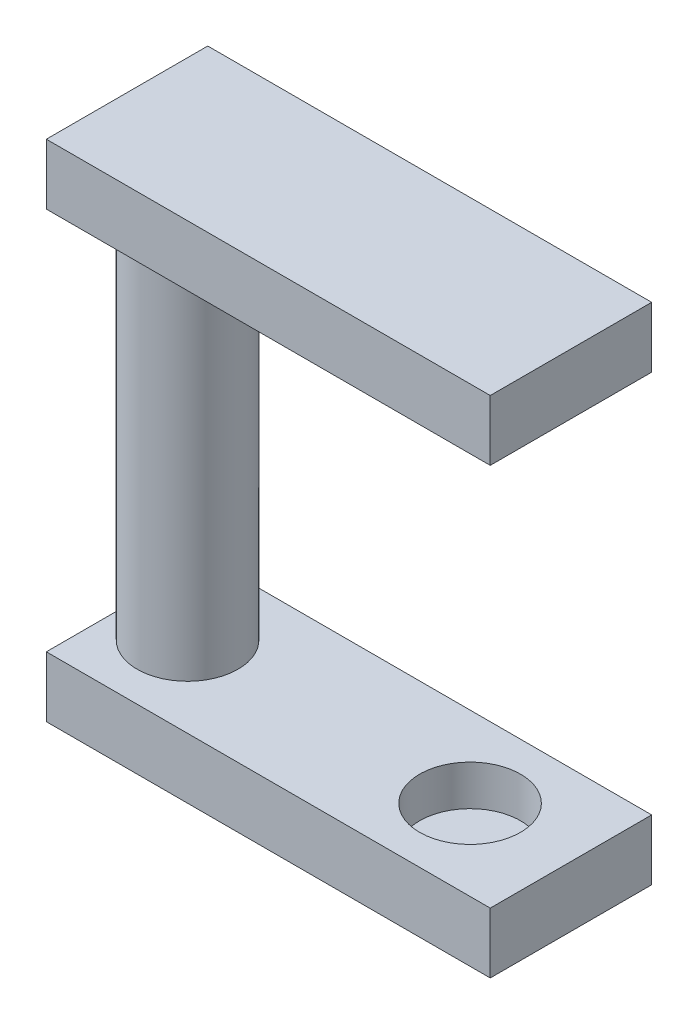
ISO-10303-21;
HEADER;
FILE_DESCRIPTION(('STEP AP214'),'2;1');
FILE_NAME('part.step','',(''),(''),'','','');
FILE_SCHEMA(('AUTOMOTIVE_DESIGN { 1 0 10303 214 1 1 1 1 }'));
ENDSEC;
DATA;
#1=APPLICATION_CONTEXT('core data for automotive mechanical design processes');
#2=APPLICATION_PROTOCOL_DEFINITION('international standard','automotive_design',2000,#1);
#3=PRODUCT_CONTEXT('',#1,'mechanical');
#4=PRODUCT('Part','Part','',(#3));
#5=PRODUCT_RELATED_PRODUCT_CATEGORY('part','',(#4));
#6=PRODUCT_DEFINITION_FORMATION('','',#4);
#7=PRODUCT_DEFINITION_CONTEXT('part definition',#1,'design');
#8=PRODUCT_DEFINITION('design','',#6,#7);
#9=PRODUCT_DEFINITION_SHAPE('','',#8);
#10=(LENGTH_UNIT() NAMED_UNIT(*) SI_UNIT(.MILLI.,.METRE.));
#11=(NAMED_UNIT(*) PLANE_ANGLE_UNIT() SI_UNIT($,.RADIAN.));
#12=(NAMED_UNIT(*) SI_UNIT($,.STERADIAN.) SOLID_ANGLE_UNIT());
#13=UNCERTAINTY_MEASURE_WITH_UNIT(LENGTH_MEASURE(1.E-05),#10,'distance_accuracy_value','');
#14=(GEOMETRIC_REPRESENTATION_CONTEXT(3) GLOBAL_UNCERTAINTY_ASSIGNED_CONTEXT((#13)) GLOBAL_UNIT_ASSIGNED_CONTEXT((#10,
#11,#12)) REPRESENTATION_CONTEXT('',''));
#15=CARTESIAN_POINT('',(0.,0.,0.));
#16=DIRECTION('',(0.,0.,1.));
#17=DIRECTION('',(1.,0.,0.));
#18=AXIS2_PLACEMENT_3D('',#15,#16,#17);
#19=CARTESIAN_POINT('',(-7.62,55.88,-10.16));
#20=DIRECTION('',(1.,0.,0.));
#21=DIRECTION('',(0.,0.,-1.));
#22=AXIS2_PLACEMENT_3D('',#19,#20,#21);
#23=PLANE('',#22);
#24=DIRECTION('',(0.,0.,1.));
#25=VECTOR('',#24,1.);
#26=CARTESIAN_POINT('',(-7.62,48.26,-10.16));
#27=LINE('',#26,#25);
#28=CARTESIAN_POINT('',(-7.62,48.26,-10.16));
#29=VERTEX_POINT('',#28);
#30=CARTESIAN_POINT('',(-7.62,48.26,10.16));
#31=VERTEX_POINT('',#30);
#32=EDGE_CURVE('E112',#29,#31,#27,.T.);
#33=ORIENTED_EDGE('',*,*,#32,.T.);
#34=DIRECTION('',(0.,-1.,0.));
#35=VECTOR('',#34,1.);
#36=CARTESIAN_POINT('',(-7.62,55.88,10.16));
#37=LINE('',#36,#35);
#38=CARTESIAN_POINT('',(-7.62,55.88,10.16));
#39=VERTEX_POINT('',#38);
#40=EDGE_CURVE('E12',#39,#31,#37,.T.);
#41=ORIENTED_EDGE('',*,*,#40,.F.);
#42=DIRECTION('',(0.,0.,1.));
#43=VECTOR('',#42,1.);
#44=CARTESIAN_POINT('',(-7.62,55.88,-10.16));
#45=LINE('',#44,#43);
#46=CARTESIAN_POINT('',(-7.62,55.88,-10.16));
#47=VERTEX_POINT('',#46);
#48=EDGE_CURVE('E100',#47,#39,#45,.T.);
#49=ORIENTED_EDGE('',*,*,#48,.F.);
#50=DIRECTION('',(0.,-1.,0.));
#51=VECTOR('',#50,1.);
#52=CARTESIAN_POINT('',(-7.62,55.88,-10.16));
#53=LINE('',#52,#51);
#54=EDGE_CURVE('E108',#47,#29,#53,.T.);
#55=ORIENTED_EDGE('',*,*,#54,.T.);
#56=EDGE_LOOP('',(#33,#41,#49,#55));
#57=FACE_BOUND('',#56,.T.);
#58=ADVANCED_FACE('F49',(#57),#23,.F.);
#59=CARTESIAN_POINT('',(-7.62,55.88,10.16));
#60=DIRECTION('',(0.,0.,-1.));
#61=DIRECTION('',(-1.,0.,0.));
#62=AXIS2_PLACEMENT_3D('',#59,#60,#61);
#63=PLANE('',#62);
#64=DIRECTION('',(1.,0.,0.));
#65=VECTOR('',#64,1.);
#66=CARTESIAN_POINT('',(-7.62,48.26,10.16));
#67=LINE('',#66,#65);
#68=CARTESIAN_POINT('',(48.26,48.26,10.16));
#69=VERTEX_POINT('',#68);
#70=EDGE_CURVE('E104',#31,#69,#67,.T.);
#71=ORIENTED_EDGE('',*,*,#70,.T.);
#72=DIRECTION('',(0.,-1.,0.));
#73=VECTOR('',#72,1.);
#74=CARTESIAN_POINT('',(48.26,55.88,10.16));
#75=LINE('',#74,#73);
#76=CARTESIAN_POINT('',(48.26,55.88,10.16));
#77=VERTEX_POINT('',#76);
#78=EDGE_CURVE('E57',#77,#69,#75,.T.);
#79=ORIENTED_EDGE('',*,*,#78,.F.);
#80=DIRECTION('',(1.,0.,0.));
#81=VECTOR('',#80,1.);
#82=CARTESIAN_POINT('',(-7.62,55.88,10.16));
#83=LINE('',#82,#81);
#84=EDGE_CURVE('E95',#39,#77,#83,.T.);
#85=ORIENTED_EDGE('',*,*,#84,.F.);
#86=ORIENTED_EDGE('',*,*,#40,.T.);
#87=EDGE_LOOP('',(#71,#79,#85,#86));
#88=FACE_BOUND('',#87,.T.);
#89=ADVANCED_FACE('F103',(#88),#63,.F.);
#90=CARTESIAN_POINT('',(48.26,55.88,-10.16));
#91=DIRECTION('',(-1.,0.,0.));
#92=DIRECTION('',(0.,0.,1.));
#93=AXIS2_PLACEMENT_3D('',#90,#91,#92);
#94=PLANE('',#93);
#95=DIRECTION('',(0.,0.,-1.));
#96=VECTOR('',#95,1.);
#97=CARTESIAN_POINT('',(48.26,48.26,-10.16));
#98=LINE('',#97,#96);
#99=CARTESIAN_POINT('',(48.26,48.26,-10.16));
#100=VERTEX_POINT('',#99);
#101=EDGE_CURVE('E82',#69,#100,#98,.T.);
#102=ORIENTED_EDGE('',*,*,#101,.T.);
#103=DIRECTION('',(0.,-1.,0.));
#104=VECTOR('',#103,1.);
#105=CARTESIAN_POINT('',(48.26,55.88,-10.16));
#106=LINE('',#105,#104);
#107=CARTESIAN_POINT('',(48.26,55.88,-10.16));
#108=VERTEX_POINT('',#107);
#109=EDGE_CURVE('E105',#108,#100,#106,.T.);
#110=ORIENTED_EDGE('',*,*,#109,.F.);
#111=DIRECTION('',(0.,0.,-1.));
#112=VECTOR('',#111,1.);
#113=CARTESIAN_POINT('',(48.26,55.88,-10.16));
#114=LINE('',#113,#112);
#115=EDGE_CURVE('E98',#77,#108,#114,.T.);
#116=ORIENTED_EDGE('',*,*,#115,.F.);
#117=ORIENTED_EDGE('',*,*,#78,.T.);
#118=EDGE_LOOP('',(#102,#110,#116,#117));
#119=FACE_BOUND('',#118,.T.);
#120=ADVANCED_FACE('F106',(#119),#94,.F.);
#121=CARTESIAN_POINT('',(-7.62,55.88,-10.16));
#122=DIRECTION('',(0.,0.,1.));
#123=DIRECTION('',(1.,0.,0.));
#124=AXIS2_PLACEMENT_3D('',#121,#122,#123);
#125=PLANE('',#124);
#126=DIRECTION('',(-1.,0.,0.));
#127=VECTOR('',#126,1.);
#128=CARTESIAN_POINT('',(-7.62,48.26,-10.16));
#129=LINE('',#128,#127);
#130=EDGE_CURVE('E88',#100,#29,#129,.T.);
#131=ORIENTED_EDGE('',*,*,#130,.T.);
#132=ORIENTED_EDGE('',*,*,#54,.F.);
#133=DIRECTION('',(-1.,0.,0.));
#134=VECTOR('',#133,1.);
#135=CARTESIAN_POINT('',(-7.62,55.88,-10.16));
#136=LINE('',#135,#134);
#137=EDGE_CURVE('E65',#108,#47,#136,.T.);
#138=ORIENTED_EDGE('',*,*,#137,.F.);
#139=ORIENTED_EDGE('',*,*,#109,.T.);
#140=EDGE_LOOP('',(#131,#132,#138,#139));
#141=FACE_BOUND('',#140,.T.);
#142=ADVANCED_FACE('F120',(#141),#125,.F.);
#143=CARTESIAN_POINT('',(0.,55.88,0.));
#144=DIRECTION('',(0.,1.,0.));
#145=DIRECTION('',(0.,0.,1.));
#146=AXIS2_PLACEMENT_3D('',#143,#144,#145);
#147=PLANE('',#146);
#148=ORIENTED_EDGE('',*,*,#48,.T.);
#149=ORIENTED_EDGE('',*,*,#84,.T.);
#150=ORIENTED_EDGE('',*,*,#115,.T.);
#151=ORIENTED_EDGE('',*,*,#137,.T.);
#152=EDGE_LOOP('',(#148,#149,#150,#151));
#153=FACE_BOUND('',#152,.T.);
#154=ADVANCED_FACE('F96',(#153),#147,.T.);
#155=CARTESIAN_POINT('',(0.,48.26,0.));
#156=DIRECTION('',(0.,1.,0.));
#157=DIRECTION('',(0.,0.,1.));
#158=AXIS2_PLACEMENT_3D('',#155,#156,#157);
#159=PLANE('',#158);
#160=CARTESIAN_POINT('',(35.56,48.26,0.));
#161=DIRECTION('',(0.,-1.,0.));
#162=DIRECTION('',(0.,0.,-1.));
#163=AXIS2_PLACEMENT_3D('',#160,#161,#162);
#164=CIRCLE('',#163,6.35000000000002);
#165=CARTESIAN_POINT('',(35.56,48.26,-6.35000000000002));
#166=VERTEX_POINT('',#165);
#167=EDGE_CURVE('E126',#166,#166,#164,.T.);
#168=ORIENTED_EDGE('',*,*,#167,.F.);
#169=EDGE_LOOP('',(#168));
#170=FACE_BOUND('',#169,.T.);
#171=ORIENTED_EDGE('',*,*,#32,.F.);
#172=ORIENTED_EDGE('',*,*,#130,.F.);
#173=ORIENTED_EDGE('',*,*,#101,.F.);
#174=ORIENTED_EDGE('',*,*,#70,.F.);
#175=EDGE_LOOP('',(#171,#172,#173,#174));
#176=FACE_BOUND('',#175,.T.);
#177=ADVANCED_FACE('F123',(#170,#176),#159,.F.);
#178=CARTESIAN_POINT('',(35.56,53.34,0.));
#179=DIRECTION('',(0.,-1.,0.));
#180=DIRECTION('',(0.,0.,-1.));
#181=AXIS2_PLACEMENT_3D('',#178,#179,#180);
#182=CYLINDRICAL_SURFACE('',#181,6.35000000000002);
#183=CARTESIAN_POINT('',(35.56,53.34,0.));
#184=DIRECTION('',(0.,-1.,0.));
#185=DIRECTION('',(0.,0.,-1.));
#186=AXIS2_PLACEMENT_3D('',#183,#184,#185);
#187=CIRCLE('',#186,6.35000000000002);
#188=CARTESIAN_POINT('',(35.56,53.34,-6.35000000000002));
#189=VERTEX_POINT('',#188);
#190=EDGE_CURVE('E115',#189,#189,#187,.T.);
#191=ORIENTED_EDGE('',*,*,#190,.F.);
#192=EDGE_LOOP('',(#191));
#193=FACE_BOUND('',#192,.T.);
#194=ORIENTED_EDGE('',*,*,#167,.T.);
#195=EDGE_LOOP('',(#194));
#196=FACE_BOUND('',#195,.T.);
#197=ADVANCED_FACE('F134',(#193,#196),#182,.F.);
#198=CARTESIAN_POINT('',(35.56,53.34,0.));
#199=DIRECTION('',(0.,-1.,0.));
#200=DIRECTION('',(0.,0.,-1.));
#201=AXIS2_PLACEMENT_3D('',#198,#199,#200);
#202=PLANE('',#201);
#203=ORIENTED_EDGE('',*,*,#190,.T.);
#204=EDGE_LOOP('',(#203));
#205=FACE_BOUND('',#204,.T.);
#206=ADVANCED_FACE('F132',(#205),#202,.T.);
#207=CLOSED_SHELL('',(#58,#89,#120,#142,#154,#177,#197,#206));
#208=MANIFOLD_SOLID_BREP('B2',#207);
#209=CARTESIAN_POINT('',(0.,48.26,0.));
#210=DIRECTION('',(0.,-1.,0.));
#211=DIRECTION('',(0.,0.,-1.));
#212=AXIS2_PLACEMENT_3D('',#209,#210,#211);
#213=CYLINDRICAL_SURFACE('',#212,6.35);
#214=CARTESIAN_POINT('',(0.,48.26,0.));
#215=DIRECTION('',(0.,1.,0.));
#216=DIRECTION('',(0.,0.,1.));
#217=AXIS2_PLACEMENT_3D('',#214,#215,#216);
#218=CIRCLE('',#217,6.35);
#219=CARTESIAN_POINT('',(0.,48.26,-6.35));
#220=VERTEX_POINT('',#219);
#221=EDGE_CURVE('E47',#220,#220,#218,.T.);
#222=CARTESIAN_POINT('',(0.,0.,0.));
#223=DIRECTION('',(0.,1.,0.));
#224=DIRECTION('',(0.,0.,1.));
#225=AXIS2_PLACEMENT_3D('',#222,#223,#224);
#226=CIRCLE('',#225,6.35);
#227=CARTESIAN_POINT('',(0.,0.,-6.35));
#228=VERTEX_POINT('',#227);
#229=EDGE_CURVE('E222',#228,#228,#226,.T.);
#230=CARTESIAN_POINT('',(0.,48.26,-6.35));
#231=CARTESIAN_POINT('',(0.,47.7572916666667,-6.35));
#232=CARTESIAN_POINT('',(0.,47.2545833333333,-6.35));
#233=CARTESIAN_POINT('',(0.,46.2491666666667,-6.35));
#234=CARTESIAN_POINT('',(0.,45.7464583333333,-6.35));
#235=CARTESIAN_POINT('',(0.,44.7410416666667,-6.35));
#236=CARTESIAN_POINT('',(0.,44.2383333333333,-6.35));
#237=CARTESIAN_POINT('',(0.,43.2329166666667,-6.35));
#238=CARTESIAN_POINT('',(0.,42.7302083333333,-6.35));
#239=CARTESIAN_POINT('',(0.,41.7247916666667,-6.35));
#240=CARTESIAN_POINT('',(0.,41.2220833333333,-6.35));
#241=CARTESIAN_POINT('',(0.,40.2166666666667,-6.35));
#242=CARTESIAN_POINT('',(0.,39.7139583333333,-6.35));
#243=CARTESIAN_POINT('',(0.,38.7085416666667,-6.35));
#244=CARTESIAN_POINT('',(0.,38.2058333333333,-6.35));
#245=CARTESIAN_POINT('',(0.,37.2004166666667,-6.35));
#246=CARTESIAN_POINT('',(0.,36.6977083333333,-6.35));
#247=CARTESIAN_POINT('',(0.,35.6922916666667,-6.35));
#248=CARTESIAN_POINT('',(0.,35.1895833333333,-6.35));
#249=CARTESIAN_POINT('',(0.,34.1841666666667,-6.35));
#250=CARTESIAN_POINT('',(0.,33.6814583333333,-6.35));
#251=CARTESIAN_POINT('',(0.,32.6760416666667,-6.35));
#252=CARTESIAN_POINT('',(0.,32.1733333333333,-6.35));
#253=CARTESIAN_POINT('',(0.,31.1679166666667,-6.35));
#254=CARTESIAN_POINT('',(0.,30.6652083333333,-6.35));
#255=CARTESIAN_POINT('',(0.,29.6597916666667,-6.35));
#256=CARTESIAN_POINT('',(0.,29.1570833333333,-6.35));
#257=CARTESIAN_POINT('',(0.,28.1516666666667,-6.35));
#258=CARTESIAN_POINT('',(0.,27.6489583333333,-6.35));
#259=CARTESIAN_POINT('',(0.,26.6435416666667,-6.35));
#260=CARTESIAN_POINT('',(0.,26.1408333333333,-6.35));
#261=CARTESIAN_POINT('',(0.,25.1354166666667,-6.35));
#262=CARTESIAN_POINT('',(0.,24.6327083333333,-6.35));
#263=CARTESIAN_POINT('',(0.,23.6272916666667,-6.35));
#264=CARTESIAN_POINT('',(0.,23.1245833333333,-6.35));
#265=CARTESIAN_POINT('',(0.,22.1191666666667,-6.35));
#266=CARTESIAN_POINT('',(0.,21.6164583333333,-6.35));
#267=CARTESIAN_POINT('',(0.,20.6110416666667,-6.35));
#268=CARTESIAN_POINT('',(0.,20.1083333333333,-6.35));
#269=CARTESIAN_POINT('',(0.,19.1029166666667,-6.35));
#270=CARTESIAN_POINT('',(0.,18.6002083333333,-6.35));
#271=CARTESIAN_POINT('',(0.,17.5947916666667,-6.35));
#272=CARTESIAN_POINT('',(0.,17.0920833333333,-6.35));
#273=CARTESIAN_POINT('',(0.,16.0866666666667,-6.35));
#274=CARTESIAN_POINT('',(0.,15.5839583333333,-6.35));
#275=CARTESIAN_POINT('',(0.,14.5785416666667,-6.35));
#276=CARTESIAN_POINT('',(0.,14.0758333333333,-6.35));
#277=CARTESIAN_POINT('',(0.,13.0704166666667,-6.35));
#278=CARTESIAN_POINT('',(0.,12.5677083333333,-6.35));
#279=CARTESIAN_POINT('',(0.,11.5622916666667,-6.35));
#280=CARTESIAN_POINT('',(0.,11.0595833333333,-6.35));
#281=CARTESIAN_POINT('',(0.,10.0541666666667,-6.35));
#282=CARTESIAN_POINT('',(0.,9.55145833333333,-6.35));
#283=CARTESIAN_POINT('',(0.,8.54604166666666,-6.35));
#284=CARTESIAN_POINT('',(0.,8.04333333333333,-6.35));
#285=CARTESIAN_POINT('',(0.,7.03791666666666,-6.35));
#286=CARTESIAN_POINT('',(0.,6.53520833333333,-6.35));
#287=CARTESIAN_POINT('',(0.,5.52979166666666,-6.35));
#288=CARTESIAN_POINT('',(0.,5.02708333333333,-6.35));
#289=CARTESIAN_POINT('',(0.,4.02166666666666,-6.35));
#290=CARTESIAN_POINT('',(0.,3.51895833333332,-6.35));
#291=CARTESIAN_POINT('',(0.,2.51354166666666,-6.35));
#292=CARTESIAN_POINT('',(0.,2.01083333333333,-6.35));
#293=CARTESIAN_POINT('',(0.,1.00541666666666,-6.35));
#294=CARTESIAN_POINT('',(0.,0.502708333333326,-6.35));
#295=CARTESIAN_POINT('',(0.,0.,-6.35));
#296=B_SPLINE_CURVE_WITH_KNOTS('',3,(#230,#231,#232,#233,#234,#235,#236,#237,#238,#239,#240,
#241,#242,#243,#244,#245,#246,#247,#248,#249,#250,#251,#252,#253,#254,#255,#256,#257,#258,#259,
#260,#261,#262,#263,#264,#265,#266,#267,#268,#269,#270,#271,#272,#273,#274,#275,#276,#277,#278,
#279,#280,#281,#282,#283,#284,#285,#286,#287,#288,#289,#290,#291,#292,#293,#294,#295),
.UNSPECIFIED.,.F.,.F.,(4,2,2,2,2,2,2,2,2,2,2,2,2,2,2,2,2,2,2,2,2,2,2,2,2,2,2,2,2,2,2,2,4),(0.,
1.508125,3.01625,4.524375,6.0325,7.540625,9.04874999999999,10.556875,12.065,13.573125,15.08125,
16.589375,18.0975,19.605625,21.11375,22.621875,24.13,25.638125,27.14625,28.654375,30.1625,
31.670625,33.17875,34.686875,36.195,37.703125,39.21125,40.719375,42.2275,43.735625,45.24375,
46.751875,48.26),.UNSPECIFIED.);
#297=EDGE_CURVE('BSEAM219',#220,#228,#296,.T.);
#298=ORIENTED_EDGE('',*,*,#221,.F.);
#299=ORIENTED_EDGE('',*,*,#229,.T.);
#300=ORIENTED_EDGE('',*,*,#297,.T.);
#301=ORIENTED_EDGE('',*,*,#297,.F.);
#302=EDGE_LOOP('',(#298,#300,#299,#301));
#303=FACE_BOUND('',#302,.T.);
#304=ADVANCED_FACE('F219',(#303),#213,.T.);
#305=CARTESIAN_POINT('',(0.,48.26,0.));
#306=DIRECTION('',(0.,1.,0.));
#307=DIRECTION('',(0.,0.,1.));
#308=AXIS2_PLACEMENT_3D('',#305,#306,#307);
#309=PLANE('',#308);
#310=ORIENTED_EDGE('',*,*,#221,.T.);
#311=EDGE_LOOP('',(#310));
#312=FACE_BOUND('',#311,.T.);
#313=ADVANCED_FACE('F318',(#312),#309,.T.);
#314=CARTESIAN_POINT('',(-7.62,-7.62,10.16));
#315=DIRECTION('',(1.,0.,0.));
#316=DIRECTION('',(0.,0.,-1.));
#317=AXIS2_PLACEMENT_3D('',#314,#315,#316);
#318=PLANE('',#317);
#319=DIRECTION('',(0.,0.,-1.));
#320=VECTOR('',#319,1.);
#321=CARTESIAN_POINT('',(-7.62,0.,10.16));
#322=LINE('',#321,#320);
#323=CARTESIAN_POINT('',(-7.62,0.,10.16));
#324=VERTEX_POINT('',#323);
#325=CARTESIAN_POINT('',(-7.62,0.,-10.16));
#326=VERTEX_POINT('',#325);
#327=EDGE_CURVE('E286',#324,#326,#322,.T.);
#328=ORIENTED_EDGE('',*,*,#327,.T.);
#329=DIRECTION('',(0.,1.,0.));
#330=VECTOR('',#329,1.);
#331=CARTESIAN_POINT('',(-7.62,-7.62,-10.16));
#332=LINE('',#331,#330);
#333=CARTESIAN_POINT('',(-7.62,-7.62,-10.16));
#334=VERTEX_POINT('',#333);
#335=EDGE_CURVE('E277',#334,#326,#332,.T.);
#336=ORIENTED_EDGE('',*,*,#335,.F.);
#337=DIRECTION('',(0.,0.,-1.));
#338=VECTOR('',#337,1.);
#339=CARTESIAN_POINT('',(-7.62,-7.62,10.16));
#340=LINE('',#339,#338);
#341=CARTESIAN_POINT('',(-7.62,-7.62,10.16));
#342=VERTEX_POINT('',#341);
#343=EDGE_CURVE('E271',#342,#334,#340,.T.);
#344=ORIENTED_EDGE('',*,*,#343,.F.);
#345=DIRECTION('',(0.,1.,0.));
#346=VECTOR('',#345,1.);
#347=CARTESIAN_POINT('',(-7.62,-7.62,10.16));
#348=LINE('',#347,#346);
#349=EDGE_CURVE('E282',#342,#324,#348,.T.);
#350=ORIENTED_EDGE('',*,*,#349,.T.);
#351=EDGE_LOOP('',(#328,#336,#344,#350));
#352=FACE_BOUND('',#351,.T.);
#353=ADVANCED_FACE('F307',(#352),#318,.F.);
#354=CARTESIAN_POINT('',(-7.62,-7.62,-10.16));
#355=DIRECTION('',(0.,0.,1.));
#356=DIRECTION('',(1.,0.,0.));
#357=AXIS2_PLACEMENT_3D('',#354,#355,#356);
#358=PLANE('',#357);
#359=DIRECTION('',(1.,0.,0.));
#360=VECTOR('',#359,1.);
#361=CARTESIAN_POINT('',(-7.62,0.,-10.16));
#362=LINE('',#361,#360);
#363=CARTESIAN_POINT('',(48.26,0.,-10.16));
#364=VERTEX_POINT('',#363);
#365=EDGE_CURVE('E276',#326,#364,#362,.T.);
#366=ORIENTED_EDGE('',*,*,#365,.T.);
#367=DIRECTION('',(0.,1.,0.));
#368=VECTOR('',#367,1.);
#369=CARTESIAN_POINT('',(48.26,-7.62,-10.16));
#370=LINE('',#369,#368);
#371=CARTESIAN_POINT('',(48.26,-7.62,-10.16));
#372=VERTEX_POINT('',#371);
#373=EDGE_CURVE('E274',#372,#364,#370,.T.);
#374=ORIENTED_EDGE('',*,*,#373,.F.);
#375=DIRECTION('',(1.,0.,0.));
#376=VECTOR('',#375,1.);
#377=CARTESIAN_POINT('',(-7.62,-7.62,-10.16));
#378=LINE('',#377,#376);
#379=EDGE_CURVE('E266',#334,#372,#378,.T.);
#380=ORIENTED_EDGE('',*,*,#379,.F.);
#381=ORIENTED_EDGE('',*,*,#335,.T.);
#382=EDGE_LOOP('',(#366,#374,#380,#381));
#383=FACE_BOUND('',#382,.T.);
#384=ADVANCED_FACE('F275',(#383),#358,.F.);
#385=CARTESIAN_POINT('',(48.26,-7.62,10.16));
#386=DIRECTION('',(-1.,0.,0.));
#387=DIRECTION('',(0.,0.,1.));
#388=AXIS2_PLACEMENT_3D('',#385,#386,#387);
#389=PLANE('',#388);
#390=DIRECTION('',(0.,0.,1.));
#391=VECTOR('',#390,1.);
#392=CARTESIAN_POINT('',(48.26,0.,10.16));
#393=LINE('',#392,#391);
#394=CARTESIAN_POINT('',(48.26,0.,10.16));
#395=VERTEX_POINT('',#394);
#396=EDGE_CURVE('E252',#364,#395,#393,.T.);
#397=ORIENTED_EDGE('',*,*,#396,.T.);
#398=DIRECTION('',(0.,1.,0.));
#399=VECTOR('',#398,1.);
#400=CARTESIAN_POINT('',(48.26,-7.62,10.16));
#401=LINE('',#400,#399);
#402=CARTESIAN_POINT('',(48.26,-7.62,10.16));
#403=VERTEX_POINT('',#402);
#404=EDGE_CURVE('E278',#403,#395,#401,.T.);
#405=ORIENTED_EDGE('',*,*,#404,.F.);
#406=DIRECTION('',(0.,0.,1.));
#407=VECTOR('',#406,1.);
#408=CARTESIAN_POINT('',(48.26,-7.62,10.16));
#409=LINE('',#408,#407);
#410=EDGE_CURVE('E269',#372,#403,#409,.T.);
#411=ORIENTED_EDGE('',*,*,#410,.F.);
#412=ORIENTED_EDGE('',*,*,#373,.T.);
#413=EDGE_LOOP('',(#397,#405,#411,#412));
#414=FACE_BOUND('',#413,.T.);
#415=ADVANCED_FACE('F280',(#414),#389,.F.);
#416=CARTESIAN_POINT('',(-7.62,-7.62,10.16));
#417=DIRECTION('',(0.,0.,-1.));
#418=DIRECTION('',(-1.,0.,0.));
#419=AXIS2_PLACEMENT_3D('',#416,#417,#418);
#420=PLANE('',#419);
#421=DIRECTION('',(-1.,0.,0.));
#422=VECTOR('',#421,1.);
#423=CARTESIAN_POINT('',(-7.62,0.,10.16));
#424=LINE('',#423,#422);
#425=EDGE_CURVE('E258',#395,#324,#424,.T.);
#426=ORIENTED_EDGE('',*,*,#425,.T.);
#427=ORIENTED_EDGE('',*,*,#349,.F.);
#428=DIRECTION('',(-1.,0.,0.));
#429=VECTOR('',#428,1.);
#430=CARTESIAN_POINT('',(-7.62,-7.62,10.16));
#431=LINE('',#430,#429);
#432=EDGE_CURVE('E235',#403,#342,#431,.T.);
#433=ORIENTED_EDGE('',*,*,#432,.F.);
#434=ORIENTED_EDGE('',*,*,#404,.T.);
#435=EDGE_LOOP('',(#426,#427,#433,#434));
#436=FACE_BOUND('',#435,.T.);
#437=ADVANCED_FACE('F308',(#436),#420,.F.);
#438=CARTESIAN_POINT('',(0.,-7.62,0.));
#439=DIRECTION('',(0.,-1.,0.));
#440=DIRECTION('',(0.,0.,-1.));
#441=AXIS2_PLACEMENT_3D('',#438,#439,#440);
#442=PLANE('',#441);
#443=ORIENTED_EDGE('',*,*,#343,.T.);
#444=ORIENTED_EDGE('',*,*,#379,.T.);
#445=ORIENTED_EDGE('',*,*,#410,.T.);
#446=ORIENTED_EDGE('',*,*,#432,.T.);
#447=EDGE_LOOP('',(#443,#444,#445,#446));
#448=FACE_BOUND('',#447,.T.);
#449=ADVANCED_FACE('F267',(#448),#442,.T.);
#450=CARTESIAN_POINT('',(0.,0.,0.));
#451=DIRECTION('',(0.,-1.,0.));
#452=DIRECTION('',(0.,0.,-1.));
#453=AXIS2_PLACEMENT_3D('',#450,#451,#452);
#454=PLANE('',#453);
#455=CARTESIAN_POINT('',(35.56,0.,0.));
#456=DIRECTION('',(0.,1.,0.));
#457=DIRECTION('',(0.,0.,1.));
#458=AXIS2_PLACEMENT_3D('',#455,#456,#457);
#459=CIRCLE('',#458,6.35000000000001);
#460=CARTESIAN_POINT('',(35.56,0.,6.35000000000001));
#461=VERTEX_POINT('',#460);
#462=EDGE_CURVE('E414',#461,#461,#459,.T.);
#463=ORIENTED_EDGE('',*,*,#462,.F.);
#464=EDGE_LOOP('',(#463));
#465=FACE_BOUND('',#464,.T.);
#466=ORIENTED_EDGE('',*,*,#229,.F.);
#467=EDGE_LOOP('',(#466));
#468=FACE_BOUND('',#467,.T.);
#469=ORIENTED_EDGE('',*,*,#327,.F.);
#470=ORIENTED_EDGE('',*,*,#425,.F.);
#471=ORIENTED_EDGE('',*,*,#396,.F.);
#472=ORIENTED_EDGE('',*,*,#365,.F.);
#473=EDGE_LOOP('',(#469,#470,#471,#472));
#474=FACE_BOUND('',#473,.T.);
#475=ADVANCED_FACE('F299',(#465,#468,#474),#454,.F.);
#476=CARTESIAN_POINT('',(35.56,-5.08,0.));
#477=DIRECTION('',(0.,1.,0.));
#478=DIRECTION('',(0.,0.,1.));
#479=AXIS2_PLACEMENT_3D('',#476,#477,#478);
#480=CYLINDRICAL_SURFACE('',#479,6.35000000000001);
#481=CARTESIAN_POINT('',(35.56,-5.08,0.));
#482=DIRECTION('',(0.,1.,0.));
#483=DIRECTION('',(0.,0.,1.));
#484=AXIS2_PLACEMENT_3D('',#481,#482,#483);
#485=CIRCLE('',#484,6.35000000000001);
#486=CARTESIAN_POINT('',(35.56,-5.08,6.35000000000001));
#487=VERTEX_POINT('',#486);
#488=EDGE_CURVE('E289',#487,#487,#485,.T.);
#489=ORIENTED_EDGE('',*,*,#488,.F.);
#490=EDGE_LOOP('',(#489));
#491=FACE_BOUND('',#490,.T.);
#492=ORIENTED_EDGE('',*,*,#462,.T.);
#493=EDGE_LOOP('',(#492));
#494=FACE_BOUND('',#493,.T.);
#495=ADVANCED_FACE('F302',(#491,#494),#480,.F.);
#496=CARTESIAN_POINT('',(35.56,-5.08,0.));
#497=DIRECTION('',(0.,1.,0.));
#498=DIRECTION('',(0.,0.,1.));
#499=AXIS2_PLACEMENT_3D('',#496,#497,#498);
#500=PLANE('',#499);
#501=ORIENTED_EDGE('',*,*,#488,.T.);
#502=EDGE_LOOP('',(#501));
#503=FACE_BOUND('',#502,.T.);
#504=ADVANCED_FACE('F368',(#503),#500,.T.);
#505=CLOSED_SHELL('',(#304,#313,#353,#384,#415,#437,#449,#475,#495,#504));
#506=MANIFOLD_SOLID_BREP('B6',#505);
#507=ADVANCED_BREP_SHAPE_REPRESENTATION('',(#18,#208,#506),#14);
#508=SHAPE_DEFINITION_REPRESENTATION(#9,#507);
ENDSEC;
END-ISO-10303-21;
